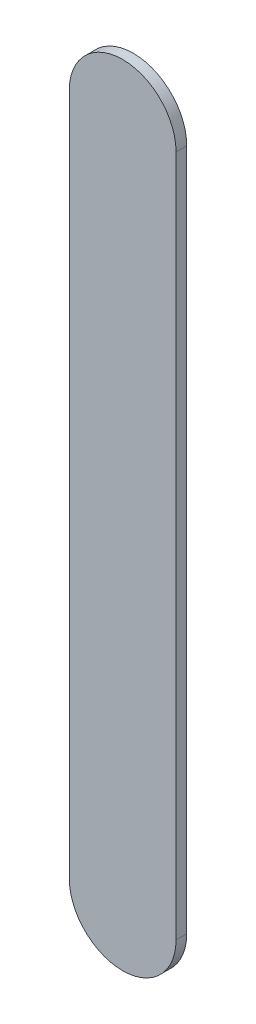
ISO-10303-21;
HEADER;
FILE_DESCRIPTION(('STEP AP214'),'2;1');
FILE_NAME('part.step','',(''),(''),'','','');
FILE_SCHEMA(('AUTOMOTIVE_DESIGN { 1 0 10303 214 1 1 1 1 }'));
ENDSEC;
DATA;
#1=APPLICATION_CONTEXT('core data for automotive mechanical design processes');
#2=APPLICATION_PROTOCOL_DEFINITION('international standard','automotive_design',2000,#1);
#3=PRODUCT_CONTEXT('',#1,'mechanical');
#4=PRODUCT('Part','Part','',(#3));
#5=PRODUCT_RELATED_PRODUCT_CATEGORY('part','',(#4));
#6=PRODUCT_DEFINITION_FORMATION('','',#4);
#7=PRODUCT_DEFINITION_CONTEXT('part definition',#1,'design');
#8=PRODUCT_DEFINITION('design','',#6,#7);
#9=PRODUCT_DEFINITION_SHAPE('','',#8);
#10=(LENGTH_UNIT() NAMED_UNIT(*) SI_UNIT(.MILLI.,.METRE.));
#11=(NAMED_UNIT(*) PLANE_ANGLE_UNIT() SI_UNIT($,.RADIAN.));
#12=(NAMED_UNIT(*) SI_UNIT($,.STERADIAN.) SOLID_ANGLE_UNIT());
#13=UNCERTAINTY_MEASURE_WITH_UNIT(LENGTH_MEASURE(1.E-05),#10,'distance_accuracy_value','');
#14=(GEOMETRIC_REPRESENTATION_CONTEXT(3) GLOBAL_UNCERTAINTY_ASSIGNED_CONTEXT((#13)) GLOBAL_UNIT_ASSIGNED_CONTEXT((#10,
#11,#12)) REPRESENTATION_CONTEXT('',''));
#15=CARTESIAN_POINT('',(0.,0.,0.));
#16=DIRECTION('',(0.,0.,1.));
#17=DIRECTION('',(1.,0.,0.));
#18=AXIS2_PLACEMENT_3D('',#15,#16,#17);
#19=CARTESIAN_POINT('',(0.,0.,1.));
#20=DIRECTION('',(0.,0.,-1.));
#21=DIRECTION('',(-1.,0.,0.));
#22=AXIS2_PLACEMENT_3D('',#19,#20,#21);
#23=CYLINDRICAL_SURFACE('',#22,5.);
#24=CARTESIAN_POINT('',(0.,0.,0.));
#25=DIRECTION('',(0.,0.,1.));
#26=DIRECTION('',(1.,0.,0.));
#27=AXIS2_PLACEMENT_3D('',#24,#25,#26);
#28=CIRCLE('',#27,5.);
#29=CARTESIAN_POINT('',(-5.,0.,0.));
#30=VERTEX_POINT('',#29);
#31=CARTESIAN_POINT('',(5.,0.,0.));
#32=VERTEX_POINT('',#31);
#33=EDGE_CURVE('E97',#30,#32,#28,.T.);
#34=ORIENTED_EDGE('',*,*,#33,.T.);
#35=DIRECTION('',(0.,0.,-1.));
#36=VECTOR('',#35,1.);
#37=CARTESIAN_POINT('',(5.,0.,1.));
#38=LINE('',#37,#36);
#39=CARTESIAN_POINT('',(5.,0.,1.));
#40=VERTEX_POINT('',#39);
#41=EDGE_CURVE('E11',#40,#32,#38,.T.);
#42=ORIENTED_EDGE('',*,*,#41,.F.);
#43=CARTESIAN_POINT('',(0.,0.,1.));
#44=DIRECTION('',(0.,0.,1.));
#45=DIRECTION('',(1.,0.,0.));
#46=AXIS2_PLACEMENT_3D('',#43,#44,#45);
#47=CIRCLE('',#46,5.);
#48=CARTESIAN_POINT('',(-5.,0.,1.));
#49=VERTEX_POINT('',#48);
#50=EDGE_CURVE('E85',#49,#40,#47,.T.);
#51=ORIENTED_EDGE('',*,*,#50,.F.);
#52=DIRECTION('',(0.,0.,-1.));
#53=VECTOR('',#52,1.);
#54=CARTESIAN_POINT('',(-5.,0.,1.));
#55=LINE('',#54,#53);
#56=EDGE_CURVE('E93',#49,#30,#55,.T.);
#57=ORIENTED_EDGE('',*,*,#56,.T.);
#58=EDGE_LOOP('',(#34,#42,#51,#57));
#59=FACE_BOUND('',#58,.T.);
#60=ADVANCED_FACE('F34',(#59),#23,.T.);
#61=CARTESIAN_POINT('',(5.,0.,1.));
#62=DIRECTION('',(-1.,0.,0.));
#63=DIRECTION('',(0.,0.,1.));
#64=AXIS2_PLACEMENT_3D('',#61,#62,#63);
#65=PLANE('',#64);
#66=DIRECTION('',(0.,1.,0.));
#67=VECTOR('',#66,1.);
#68=CARTESIAN_POINT('',(5.,0.,0.));
#69=LINE('',#68,#67);
#70=CARTESIAN_POINT('',(5.,63.9,0.));
#71=VERTEX_POINT('',#70);
#72=EDGE_CURVE('E89',#32,#71,#69,.T.);
#73=ORIENTED_EDGE('',*,*,#72,.T.);
#74=DIRECTION('',(0.,0.,-1.));
#75=VECTOR('',#74,1.);
#76=CARTESIAN_POINT('',(5.,63.9,1.));
#77=LINE('',#76,#75);
#78=CARTESIAN_POINT('',(5.,63.9,1.));
#79=VERTEX_POINT('',#78);
#80=EDGE_CURVE('E42',#79,#71,#77,.T.);
#81=ORIENTED_EDGE('',*,*,#80,.F.);
#82=DIRECTION('',(0.,1.,0.));
#83=VECTOR('',#82,1.);
#84=CARTESIAN_POINT('',(5.,0.,1.));
#85=LINE('',#84,#83);
#86=EDGE_CURVE('E80',#40,#79,#85,.T.);
#87=ORIENTED_EDGE('',*,*,#86,.F.);
#88=ORIENTED_EDGE('',*,*,#41,.T.);
#89=EDGE_LOOP('',(#73,#81,#87,#88));
#90=FACE_BOUND('',#89,.T.);
#91=ADVANCED_FACE('F88',(#90),#65,.F.);
#92=CARTESIAN_POINT('',(0.,63.9,1.));
#93=DIRECTION('',(0.,0.,-1.));
#94=DIRECTION('',(-1.,0.,0.));
#95=AXIS2_PLACEMENT_3D('',#92,#93,#94);
#96=CYLINDRICAL_SURFACE('',#95,5.);
#97=CARTESIAN_POINT('',(0.,63.9,0.));
#98=DIRECTION('',(0.,0.,1.));
#99=DIRECTION('',(1.,0.,0.));
#100=AXIS2_PLACEMENT_3D('',#97,#98,#99);
#101=CIRCLE('',#100,5.);
#102=CARTESIAN_POINT('',(-5.,63.9,0.));
#103=VERTEX_POINT('',#102);
#104=EDGE_CURVE('E67',#71,#103,#101,.T.);
#105=ORIENTED_EDGE('',*,*,#104,.T.);
#106=DIRECTION('',(0.,0.,-1.));
#107=VECTOR('',#106,1.);
#108=CARTESIAN_POINT('',(-5.,63.9,1.));
#109=LINE('',#108,#107);
#110=CARTESIAN_POINT('',(-5.,63.9,1.));
#111=VERTEX_POINT('',#110);
#112=EDGE_CURVE('E90',#111,#103,#109,.T.);
#113=ORIENTED_EDGE('',*,*,#112,.F.);
#114=CARTESIAN_POINT('',(0.,63.9,1.));
#115=DIRECTION('',(0.,0.,1.));
#116=DIRECTION('',(1.,0.,0.));
#117=AXIS2_PLACEMENT_3D('',#114,#115,#116);
#118=CIRCLE('',#117,5.);
#119=EDGE_CURVE('E83',#79,#111,#118,.T.);
#120=ORIENTED_EDGE('',*,*,#119,.F.);
#121=ORIENTED_EDGE('',*,*,#80,.T.);
#122=EDGE_LOOP('',(#105,#113,#120,#121));
#123=FACE_BOUND('',#122,.T.);
#124=ADVANCED_FACE('F91',(#123),#96,.T.);
#125=CARTESIAN_POINT('',(-5.,0.,1.));
#126=DIRECTION('',(1.,0.,0.));
#127=DIRECTION('',(0.,0.,-1.));
#128=AXIS2_PLACEMENT_3D('',#125,#126,#127);
#129=PLANE('',#128);
#130=DIRECTION('',(0.,-1.,0.));
#131=VECTOR('',#130,1.);
#132=CARTESIAN_POINT('',(-5.,0.,0.));
#133=LINE('',#132,#131);
#134=EDGE_CURVE('E73',#103,#30,#133,.T.);
#135=ORIENTED_EDGE('',*,*,#134,.T.);
#136=ORIENTED_EDGE('',*,*,#56,.F.);
#137=DIRECTION('',(0.,-1.,0.));
#138=VECTOR('',#137,1.);
#139=CARTESIAN_POINT('',(-5.,0.,1.));
#140=LINE('',#139,#138);
#141=EDGE_CURVE('E50',#111,#49,#140,.T.);
#142=ORIENTED_EDGE('',*,*,#141,.F.);
#143=ORIENTED_EDGE('',*,*,#112,.T.);
#144=EDGE_LOOP('',(#135,#136,#142,#143));
#145=FACE_BOUND('',#144,.T.);
#146=ADVANCED_FACE('F104',(#145),#129,.F.);
#147=CARTESIAN_POINT('',(0.,0.,1.));
#148=DIRECTION('',(0.,0.,1.));
#149=DIRECTION('',(1.,0.,0.));
#150=AXIS2_PLACEMENT_3D('',#147,#148,#149);
#151=PLANE('',#150);
#152=ORIENTED_EDGE('',*,*,#50,.T.);
#153=ORIENTED_EDGE('',*,*,#86,.T.);
#154=ORIENTED_EDGE('',*,*,#119,.T.);
#155=ORIENTED_EDGE('',*,*,#141,.T.);
#156=EDGE_LOOP('',(#152,#153,#154,#155));
#157=FACE_BOUND('',#156,.T.);
#158=ADVANCED_FACE('F81',(#157),#151,.T.);
#159=CARTESIAN_POINT('',(0.,0.,0.));
#160=DIRECTION('',(0.,0.,1.));
#161=DIRECTION('',(1.,0.,0.));
#162=AXIS2_PLACEMENT_3D('',#159,#160,#161);
#163=PLANE('',#162);
#164=ORIENTED_EDGE('',*,*,#33,.F.);
#165=ORIENTED_EDGE('',*,*,#134,.F.);
#166=ORIENTED_EDGE('',*,*,#104,.F.);
#167=ORIENTED_EDGE('',*,*,#72,.F.);
#168=EDGE_LOOP('',(#164,#165,#166,#167));
#169=FACE_BOUND('',#168,.T.);
#170=ADVANCED_FACE('F107',(#169),#163,.F.);
#171=CLOSED_SHELL('',(#60,#91,#124,#146,#158,#170));
#172=MANIFOLD_SOLID_BREP('B2',#171);
#173=ADVANCED_BREP_SHAPE_REPRESENTATION('',(#18,#172),#14);
#174=SHAPE_DEFINITION_REPRESENTATION(#9,#173);
ENDSEC;
END-ISO-10303-21;
